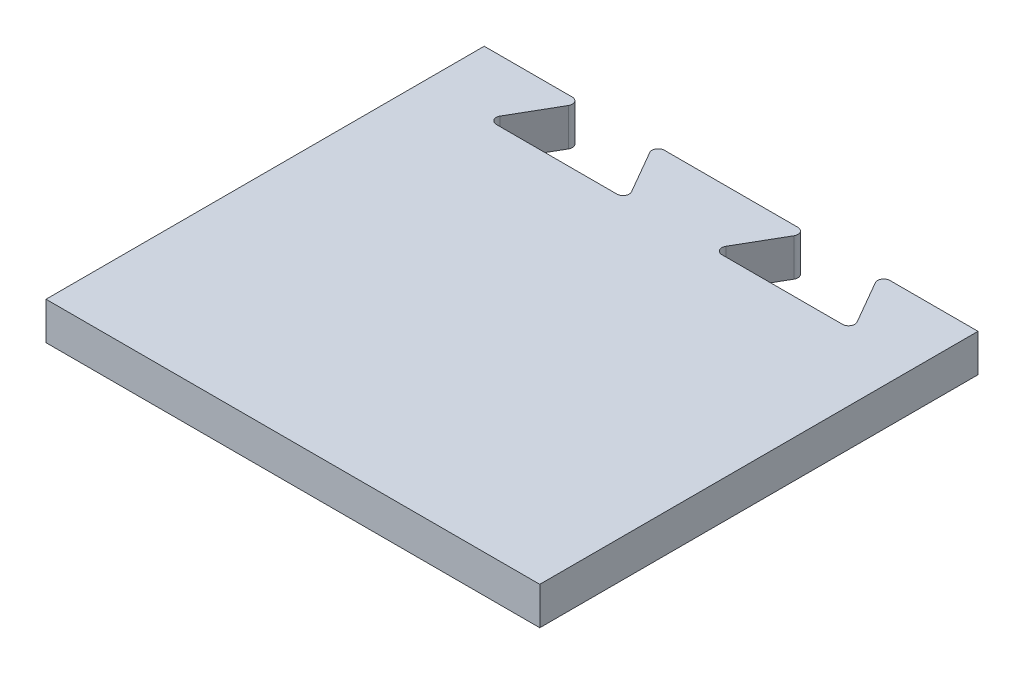
ISO-10303-21;
HEADER;
FILE_DESCRIPTION(('STEP AP214'),'2;1');
FILE_NAME('part.step','',(''),(''),'','','');
FILE_SCHEMA(('AUTOMOTIVE_DESIGN { 1 0 10303 214 1 1 1 1 }'));
ENDSEC;
DATA;
#1=APPLICATION_CONTEXT('core data for automotive mechanical design processes');
#2=APPLICATION_PROTOCOL_DEFINITION('international standard','automotive_design',2000,#1);
#3=PRODUCT_CONTEXT('',#1,'mechanical');
#4=PRODUCT('Part','Part','',(#3));
#5=PRODUCT_RELATED_PRODUCT_CATEGORY('part','',(#4));
#6=PRODUCT_DEFINITION_FORMATION('','',#4);
#7=PRODUCT_DEFINITION_CONTEXT('part definition',#1,'design');
#8=PRODUCT_DEFINITION('design','',#6,#7);
#9=PRODUCT_DEFINITION_SHAPE('','',#8);
#10=(LENGTH_UNIT() NAMED_UNIT(*) SI_UNIT(.MILLI.,.METRE.));
#11=(NAMED_UNIT(*) PLANE_ANGLE_UNIT() SI_UNIT($,.RADIAN.));
#12=(NAMED_UNIT(*) SI_UNIT($,.STERADIAN.) SOLID_ANGLE_UNIT());
#13=UNCERTAINTY_MEASURE_WITH_UNIT(LENGTH_MEASURE(1.E-05),#10,'distance_accuracy_value','');
#14=(GEOMETRIC_REPRESENTATION_CONTEXT(3) GLOBAL_UNCERTAINTY_ASSIGNED_CONTEXT((#13)) GLOBAL_UNIT_ASSIGNED_CONTEXT((#10,
#11,#12)) REPRESENTATION_CONTEXT('',''));
#15=CARTESIAN_POINT('',(0.,0.,0.));
#16=DIRECTION('',(0.,0.,1.));
#17=DIRECTION('',(1.,0.,0.));
#18=AXIS2_PLACEMENT_3D('',#15,#16,#17);
#19=CARTESIAN_POINT('',(40.,3.05,0.));
#20=DIRECTION('',(0.,0.,-1.));
#21=DIRECTION('',(-1.,0.,0.));
#22=AXIS2_PLACEMENT_3D('',#19,#20,#21);
#23=PLANE('',#22);
#24=DIRECTION('',(1.,0.,0.));
#25=VECTOR('',#24,1.);
#26=CARTESIAN_POINT('',(40.,0.,0.));
#27=LINE('',#26,#25);
#28=CARTESIAN_POINT('',(0.,0.,0.));
#29=VERTEX_POINT('',#28);
#30=CARTESIAN_POINT('',(40.,0.,0.));
#31=VERTEX_POINT('',#30);
#32=EDGE_CURVE('E206',#29,#31,#27,.T.);
#33=ORIENTED_EDGE('',*,*,#32,.T.);
#34=DIRECTION('',(0.,-1.,0.));
#35=VECTOR('',#34,1.);
#36=CARTESIAN_POINT('',(40.,3.05,0.));
#37=LINE('',#36,#35);
#38=CARTESIAN_POINT('',(40.,3.05,0.));
#39=VERTEX_POINT('',#38);
#40=EDGE_CURVE('E185',#39,#31,#37,.T.);
#41=ORIENTED_EDGE('',*,*,#40,.F.);
#42=DIRECTION('',(1.,0.,0.));
#43=VECTOR('',#42,1.);
#44=CARTESIAN_POINT('',(40.,3.05,0.));
#45=LINE('',#44,#43);
#46=CARTESIAN_POINT('',(0.,3.05,0.));
#47=VERTEX_POINT('',#46);
#48=EDGE_CURVE('E193',#47,#39,#45,.T.);
#49=ORIENTED_EDGE('',*,*,#48,.F.);
#50=DIRECTION('',(0.,-1.,0.));
#51=VECTOR('',#50,1.);
#52=CARTESIAN_POINT('',(0.,3.05,0.));
#53=LINE('',#52,#51);
#54=EDGE_CURVE('E346',#47,#29,#53,.T.);
#55=ORIENTED_EDGE('',*,*,#54,.T.);
#56=EDGE_LOOP('',(#33,#41,#49,#55));
#57=FACE_BOUND('',#56,.T.);
#58=ADVANCED_FACE('F42',(#57),#23,.F.);
#59=CARTESIAN_POINT('',(40.,3.05,-35.5));
#60=DIRECTION('',(-1.,0.,0.));
#61=DIRECTION('',(0.,0.,1.));
#62=AXIS2_PLACEMENT_3D('',#59,#60,#61);
#63=PLANE('',#62);
#64=DIRECTION('',(0.,0.,-1.));
#65=VECTOR('',#64,1.);
#66=CARTESIAN_POINT('',(40.,0.,-35.5));
#67=LINE('',#66,#65);
#68=CARTESIAN_POINT('',(40.,0.,-35.5));
#69=VERTEX_POINT('',#68);
#70=EDGE_CURVE('E349',#31,#69,#67,.T.);
#71=ORIENTED_EDGE('',*,*,#70,.T.);
#72=DIRECTION('',(0.,-1.,0.));
#73=VECTOR('',#72,1.);
#74=CARTESIAN_POINT('',(40.,3.05,-35.5));
#75=LINE('',#74,#73);
#76=CARTESIAN_POINT('',(40.,3.05,-35.5));
#77=VERTEX_POINT('',#76);
#78=EDGE_CURVE('E188',#77,#69,#75,.T.);
#79=ORIENTED_EDGE('',*,*,#78,.F.);
#80=DIRECTION('',(0.,0.,-1.));
#81=VECTOR('',#80,1.);
#82=CARTESIAN_POINT('',(40.,3.05,-35.5));
#83=LINE('',#82,#81);
#84=EDGE_CURVE('E181',#39,#77,#83,.T.);
#85=ORIENTED_EDGE('',*,*,#84,.F.);
#86=ORIENTED_EDGE('',*,*,#40,.T.);
#87=EDGE_LOOP('',(#71,#79,#85,#86));
#88=FACE_BOUND('',#87,.T.);
#89=ADVANCED_FACE('F183',(#88),#63,.F.);
#90=CARTESIAN_POINT('',(32.,3.05,-35.5));
#91=DIRECTION('',(0.,0.,1.));
#92=DIRECTION('',(1.,0.,0.));
#93=AXIS2_PLACEMENT_3D('',#90,#91,#92);
#94=PLANE('',#93);
#95=DIRECTION('',(-1.,0.,0.));
#96=VECTOR('',#95,1.);
#97=CARTESIAN_POINT('',(32.,0.,-35.5));
#98=LINE('',#97,#96);
#99=CARTESIAN_POINT('',(32.8660254037844,0.,-35.5));
#100=VERTEX_POINT('',#99);
#101=EDGE_CURVE('E352',#69,#100,#98,.T.);
#102=ORIENTED_EDGE('',*,*,#101,.T.);
#103=DIRECTION('',(0.,-1.,0.));
#104=VECTOR('',#103,1.);
#105=CARTESIAN_POINT('',(32.8660254037844,3.05,-35.5));
#106=LINE('',#105,#104);
#107=CARTESIAN_POINT('',(32.8660254037844,3.05,-35.5));
#108=VERTEX_POINT('',#107);
#109=EDGE_CURVE('E240',#100,#108,#106,.F.);
#110=ORIENTED_EDGE('',*,*,#109,.T.);
#111=DIRECTION('',(-1.,0.,0.));
#112=VECTOR('',#111,1.);
#113=CARTESIAN_POINT('',(32.,3.05,-35.5));
#114=LINE('',#113,#112);
#115=EDGE_CURVE('E192',#77,#108,#114,.T.);
#116=ORIENTED_EDGE('',*,*,#115,.F.);
#117=ORIENTED_EDGE('',*,*,#78,.T.);
#118=EDGE_LOOP('',(#102,#110,#116,#117));
#119=FACE_BOUND('',#118,.T.);
#120=ADVANCED_FACE('F393',(#119),#94,.F.);
#121=CARTESIAN_POINT('',(34.8867513459482,3.05,-30.5));
#122=DIRECTION('',(0.866025403784436,0.,-0.500000000000005));
#123=DIRECTION('',(-0.500000000000005,0.,-0.866025403784436));
#124=AXIS2_PLACEMENT_3D('',#121,#122,#123);
#125=PLANE('',#124);
#126=DIRECTION('',(0.500000000000005,0.,0.866025403784436));
#127=VECTOR('',#126,1.);
#128=CARTESIAN_POINT('',(34.8867513459482,0.,-30.5));
#129=LINE('',#128,#127);
#130=CARTESIAN_POINT('',(32.4330127018922,0.,-34.75));
#131=VERTEX_POINT('',#130);
#132=CARTESIAN_POINT('',(34.4537386440559,0.,-31.25));
#133=VERTEX_POINT('',#132);
#134=EDGE_CURVE('E356',#131,#133,#129,.T.);
#135=ORIENTED_EDGE('',*,*,#134,.T.);
#136=DIRECTION('',(0.,-1.,0.));
#137=VECTOR('',#136,1.);
#138=CARTESIAN_POINT('',(34.4537386440559,3.05,-31.25));
#139=LINE('',#138,#137);
#140=CARTESIAN_POINT('',(34.4537386440559,3.05,-31.25));
#141=VERTEX_POINT('',#140);
#142=EDGE_CURVE('E225',#133,#141,#139,.F.);
#143=ORIENTED_EDGE('',*,*,#142,.T.);
#144=DIRECTION('',(0.500000000000005,0.,0.866025403784436));
#145=VECTOR('',#144,1.);
#146=CARTESIAN_POINT('',(34.8867513459482,3.05,-30.5));
#147=LINE('',#146,#145);
#148=CARTESIAN_POINT('',(32.4330127018922,3.05,-34.75));
#149=VERTEX_POINT('',#148);
#150=EDGE_CURVE('E397',#149,#141,#147,.T.);
#151=ORIENTED_EDGE('',*,*,#150,.F.);
#152=DIRECTION('',(0.,-1.,0.));
#153=VECTOR('',#152,1.);
#154=CARTESIAN_POINT('',(32.4330127018922,3.05,-34.75));
#155=LINE('',#154,#153);
#156=EDGE_CURVE('E221',#149,#131,#155,.T.);
#157=ORIENTED_EDGE('',*,*,#156,.T.);
#158=EDGE_LOOP('',(#135,#143,#151,#157));
#159=FACE_BOUND('',#158,.T.);
#160=ADVANCED_FACE('F457',(#159),#125,.F.);
#161=CARTESIAN_POINT('',(23.3867513459482,3.05,-30.5));
#162=DIRECTION('',(0.,0.,1.));
#163=DIRECTION('',(1.,0.,0.));
#164=AXIS2_PLACEMENT_3D('',#161,#162,#163);
#165=PLANE('',#164);
#166=DIRECTION('',(-1.,0.,0.));
#167=VECTOR('',#166,1.);
#168=CARTESIAN_POINT('',(23.3867513459482,3.05,-30.5));
#169=LINE('',#168,#167);
#170=CARTESIAN_POINT('',(34.0207259421637,3.05,-30.5));
#171=VERTEX_POINT('',#170);
#172=CARTESIAN_POINT('',(24.2527767497326,3.05,-30.5));
#173=VERTEX_POINT('',#172);
#174=EDGE_CURVE('E401',#171,#173,#169,.T.);
#175=ORIENTED_EDGE('',*,*,#174,.F.);
#176=DIRECTION('',(0.,-1.,0.));
#177=VECTOR('',#176,1.);
#178=CARTESIAN_POINT('',(34.0207259421637,0.,-30.5));
#179=LINE('',#178,#177);
#180=CARTESIAN_POINT('',(34.0207259421637,0.,-30.5));
#181=VERTEX_POINT('',#180);
#182=EDGE_CURVE('E212',#171,#181,#179,.T.);
#183=ORIENTED_EDGE('',*,*,#182,.T.);
#184=DIRECTION('',(-1.,0.,0.));
#185=VECTOR('',#184,1.);
#186=CARTESIAN_POINT('',(23.3867513459482,0.,-30.5));
#187=LINE('',#186,#185);
#188=CARTESIAN_POINT('',(24.2527767497326,0.,-30.5));
#189=VERTEX_POINT('',#188);
#190=EDGE_CURVE('E360',#181,#189,#187,.T.);
#191=ORIENTED_EDGE('',*,*,#190,.T.);
#192=DIRECTION('',(0.,-1.,0.));
#193=VECTOR('',#192,1.);
#194=CARTESIAN_POINT('',(24.2527767497326,3.05,-30.5));
#195=LINE('',#194,#193);
#196=EDGE_CURVE('E208',#189,#173,#195,.F.);
#197=ORIENTED_EDGE('',*,*,#196,.T.);
#198=EDGE_LOOP('',(#175,#183,#191,#197));
#199=FACE_BOUND('',#198,.T.);
#200=ADVANCED_FACE('F450',(#199),#165,.F.);
#201=CARTESIAN_POINT('',(26.2735026918963,3.05,-35.5));
#202=DIRECTION('',(-0.866025403784436,0.,-0.500000000000004));
#203=DIRECTION('',(-0.500000000000004,0.,0.866025403784436));
#204=AXIS2_PLACEMENT_3D('',#201,#202,#203);
#205=PLANE('',#204);
#206=DIRECTION('',(0.500000000000004,0.,-0.866025403784436));
#207=VECTOR('',#206,1.);
#208=CARTESIAN_POINT('',(26.2735026918963,3.05,-35.5));
#209=LINE('',#208,#207);
#210=CARTESIAN_POINT('',(23.8197640478404,3.05,-31.25));
#211=VERTEX_POINT('',#210);
#212=CARTESIAN_POINT('',(25.8404899900041,3.05,-34.75));
#213=VERTEX_POINT('',#212);
#214=EDGE_CURVE('E407',#211,#213,#209,.T.);
#215=ORIENTED_EDGE('',*,*,#214,.F.);
#216=DIRECTION('',(0.,-1.,0.));
#217=VECTOR('',#216,1.);
#218=CARTESIAN_POINT('',(23.8197640478404,0.,-31.25));
#219=LINE('',#218,#217);
#220=CARTESIAN_POINT('',(23.8197640478404,0.,-31.25));
#221=VERTEX_POINT('',#220);
#222=EDGE_CURVE('E257',#211,#221,#219,.T.);
#223=ORIENTED_EDGE('',*,*,#222,.T.);
#224=DIRECTION('',(0.500000000000004,0.,-0.866025403784436));
#225=VECTOR('',#224,1.);
#226=CARTESIAN_POINT('',(26.2735026918963,0.,-35.5));
#227=LINE('',#226,#225);
#228=CARTESIAN_POINT('',(25.8404899900041,0.,-34.75));
#229=VERTEX_POINT('',#228);
#230=EDGE_CURVE('E364',#221,#229,#227,.T.);
#231=ORIENTED_EDGE('',*,*,#230,.T.);
#232=DIRECTION('',(0.,-1.,0.));
#233=VECTOR('',#232,1.);
#234=CARTESIAN_POINT('',(25.8404899900041,3.05,-34.75));
#235=LINE('',#234,#233);
#236=EDGE_CURVE('E254',#229,#213,#235,.F.);
#237=ORIENTED_EDGE('',*,*,#236,.T.);
#238=EDGE_LOOP('',(#215,#223,#231,#237));
#239=FACE_BOUND('',#238,.T.);
#240=ADVANCED_FACE('F441',(#239),#205,.F.);
#241=CARTESIAN_POINT('',(13.7264973081037,3.05,-35.5));
#242=DIRECTION('',(0.,0.,1.));
#243=DIRECTION('',(1.,0.,0.));
#244=AXIS2_PLACEMENT_3D('',#241,#242,#243);
#245=PLANE('',#244);
#246=DIRECTION('',(-1.,0.,0.));
#247=VECTOR('',#246,1.);
#248=CARTESIAN_POINT('',(13.7264973081037,3.05,-35.5));
#249=LINE('',#248,#247);
#250=CARTESIAN_POINT('',(25.4074772881119,3.05,-35.5));
#251=VERTEX_POINT('',#250);
#252=CARTESIAN_POINT('',(14.5925227118881,3.05,-35.5));
#253=VERTEX_POINT('',#252);
#254=EDGE_CURVE('E411',#251,#253,#249,.T.);
#255=ORIENTED_EDGE('',*,*,#254,.F.);
#256=DIRECTION('',(0.,-1.,0.));
#257=VECTOR('',#256,1.);
#258=CARTESIAN_POINT('',(25.4074772881119,3.05,-35.5));
#259=LINE('',#258,#257);
#260=CARTESIAN_POINT('',(25.4074772881119,0.,-35.5));
#261=VERTEX_POINT('',#260);
#262=EDGE_CURVE('E264',#251,#261,#259,.T.);
#263=ORIENTED_EDGE('',*,*,#262,.T.);
#264=DIRECTION('',(-1.,0.,0.));
#265=VECTOR('',#264,1.);
#266=CARTESIAN_POINT('',(13.7264973081037,0.,-35.5));
#267=LINE('',#266,#265);
#268=CARTESIAN_POINT('',(14.5925227118881,0.,-35.5));
#269=VERTEX_POINT('',#268);
#270=EDGE_CURVE('E368',#261,#269,#267,.T.);
#271=ORIENTED_EDGE('',*,*,#270,.T.);
#272=DIRECTION('',(0.,-1.,0.));
#273=VECTOR('',#272,1.);
#274=CARTESIAN_POINT('',(14.5925227118881,3.05,-35.5));
#275=LINE('',#274,#273);
#276=EDGE_CURVE('E261',#269,#253,#275,.F.);
#277=ORIENTED_EDGE('',*,*,#276,.T.);
#278=EDGE_LOOP('',(#255,#263,#271,#277));
#279=FACE_BOUND('',#278,.T.);
#280=ADVANCED_FACE('F432',(#279),#245,.F.);
#281=CARTESIAN_POINT('',(16.6132486540518,3.05,-30.5));
#282=DIRECTION('',(0.866025403784436,0.,-0.500000000000005));
#283=DIRECTION('',(-0.500000000000005,0.,-0.866025403784436));
#284=AXIS2_PLACEMENT_3D('',#281,#282,#283);
#285=PLANE('',#284);
#286=DIRECTION('',(0.500000000000005,0.,0.866025403784436));
#287=VECTOR('',#286,1.);
#288=CARTESIAN_POINT('',(16.6132486540518,3.05,-30.5));
#289=LINE('',#288,#287);
#290=CARTESIAN_POINT('',(14.1595100099959,3.05,-34.75));
#291=VERTEX_POINT('',#290);
#292=CARTESIAN_POINT('',(16.1802359521596,3.05,-31.25));
#293=VERTEX_POINT('',#292);
#294=EDGE_CURVE('E340',#291,#293,#289,.T.);
#295=ORIENTED_EDGE('',*,*,#294,.F.);
#296=DIRECTION('',(0.,-1.,0.));
#297=VECTOR('',#296,1.);
#298=CARTESIAN_POINT('',(14.1595100099959,3.05,-34.75));
#299=LINE('',#298,#297);
#300=CARTESIAN_POINT('',(14.1595100099959,0.,-34.75));
#301=VERTEX_POINT('',#300);
#302=EDGE_CURVE('E271',#291,#301,#299,.T.);
#303=ORIENTED_EDGE('',*,*,#302,.T.);
#304=DIRECTION('',(0.500000000000005,0.,0.866025403784436));
#305=VECTOR('',#304,1.);
#306=CARTESIAN_POINT('',(16.6132486540518,0.,-30.5));
#307=LINE('',#306,#305);
#308=CARTESIAN_POINT('',(16.1802359521596,0.,-31.25));
#309=VERTEX_POINT('',#308);
#310=EDGE_CURVE('E327',#301,#309,#307,.T.);
#311=ORIENTED_EDGE('',*,*,#310,.T.);
#312=DIRECTION('',(0.,-1.,0.));
#313=VECTOR('',#312,1.);
#314=CARTESIAN_POINT('',(16.1802359521596,3.05,-31.25));
#315=LINE('',#314,#313);
#316=EDGE_CURVE('E268',#309,#293,#315,.F.);
#317=ORIENTED_EDGE('',*,*,#316,.T.);
#318=EDGE_LOOP('',(#295,#303,#311,#317));
#319=FACE_BOUND('',#318,.T.);
#320=ADVANCED_FACE('F425',(#319),#285,.F.);
#321=CARTESIAN_POINT('',(5.11324865405184,3.05,-30.5));
#322=DIRECTION('',(0.,0.,1.));
#323=DIRECTION('',(1.,0.,0.));
#324=AXIS2_PLACEMENT_3D('',#321,#322,#323);
#325=PLANE('',#324);
#326=DIRECTION('',(-1.,0.,0.));
#327=VECTOR('',#326,1.);
#328=CARTESIAN_POINT('',(5.11324865405184,3.05,-30.5));
#329=LINE('',#328,#327);
#330=CARTESIAN_POINT('',(15.7472232502674,3.05,-30.5));
#331=VERTEX_POINT('',#330);
#332=CARTESIAN_POINT('',(5.97927405783628,3.05,-30.5));
#333=VERTEX_POINT('',#332);
#334=EDGE_CURVE('E332',#331,#333,#329,.T.);
#335=ORIENTED_EDGE('',*,*,#334,.F.);
#336=DIRECTION('',(0.,-1.,0.));
#337=VECTOR('',#336,1.);
#338=CARTESIAN_POINT('',(15.7472232502674,0.,-30.5));
#339=LINE('',#338,#337);
#340=CARTESIAN_POINT('',(15.7472232502674,0.,-30.5));
#341=VERTEX_POINT('',#340);
#342=EDGE_CURVE('E278',#331,#341,#339,.T.);
#343=ORIENTED_EDGE('',*,*,#342,.T.);
#344=DIRECTION('',(-1.,0.,0.));
#345=VECTOR('',#344,1.);
#346=CARTESIAN_POINT('',(5.11324865405184,0.,-30.5));
#347=LINE('',#346,#345);
#348=CARTESIAN_POINT('',(5.97927405783628,0.,-30.5));
#349=VERTEX_POINT('',#348);
#350=EDGE_CURVE('E316',#341,#349,#347,.T.);
#351=ORIENTED_EDGE('',*,*,#350,.T.);
#352=DIRECTION('',(0.,-1.,0.));
#353=VECTOR('',#352,1.);
#354=CARTESIAN_POINT('',(5.97927405783628,3.05,-30.5));
#355=LINE('',#354,#353);
#356=EDGE_CURVE('E275',#349,#333,#355,.F.);
#357=ORIENTED_EDGE('',*,*,#356,.T.);
#358=EDGE_LOOP('',(#335,#343,#351,#357));
#359=FACE_BOUND('',#358,.T.);
#360=ADVANCED_FACE('F323',(#359),#325,.F.);
#361=CARTESIAN_POINT('',(8.,3.05,-35.5));
#362=DIRECTION('',(-0.866025403784436,0.,-0.500000000000004));
#363=DIRECTION('',(-0.500000000000004,0.,0.866025403784436));
#364=AXIS2_PLACEMENT_3D('',#361,#362,#363);
#365=PLANE('',#364);
#366=DIRECTION('',(0.500000000000004,0.,-0.866025403784436));
#367=VECTOR('',#366,1.);
#368=CARTESIAN_POINT('',(8.,3.05,-35.5));
#369=LINE('',#368,#367);
#370=CARTESIAN_POINT('',(5.54626135594406,3.05,-31.25));
#371=VERTEX_POINT('',#370);
#372=CARTESIAN_POINT('',(7.56698729810778,3.05,-34.75));
#373=VERTEX_POINT('',#372);
#374=EDGE_CURVE('E331',#371,#373,#369,.T.);
#375=ORIENTED_EDGE('',*,*,#374,.F.);
#376=DIRECTION('',(0.,-1.,0.));
#377=VECTOR('',#376,1.);
#378=CARTESIAN_POINT('',(5.54626135594406,0.,-31.25));
#379=LINE('',#378,#377);
#380=CARTESIAN_POINT('',(5.54626135594406,0.,-31.25));
#381=VERTEX_POINT('',#380);
#382=EDGE_CURVE('E284',#371,#381,#379,.T.);
#383=ORIENTED_EDGE('',*,*,#382,.T.);
#384=DIRECTION('',(0.500000000000004,0.,-0.866025403784436));
#385=VECTOR('',#384,1.);
#386=CARTESIAN_POINT('',(8.,0.,-35.5));
#387=LINE('',#386,#385);
#388=CARTESIAN_POINT('',(7.56698729810778,0.,-34.75));
#389=VERTEX_POINT('',#388);
#390=EDGE_CURVE('E317',#381,#389,#387,.T.);
#391=ORIENTED_EDGE('',*,*,#390,.T.);
#392=DIRECTION('',(0.,-1.,0.));
#393=VECTOR('',#392,1.);
#394=CARTESIAN_POINT('',(7.56698729810778,3.05,-34.75));
#395=LINE('',#394,#393);
#396=EDGE_CURVE('E66',#389,#373,#395,.F.);
#397=ORIENTED_EDGE('',*,*,#396,.T.);
#398=EDGE_LOOP('',(#375,#383,#391,#397));
#399=FACE_BOUND('',#398,.T.);
#400=ADVANCED_FACE('F333',(#399),#365,.F.);
#401=CARTESIAN_POINT('',(0.,3.05,-35.5));
#402=DIRECTION('',(0.,0.,1.));
#403=DIRECTION('',(1.,0.,0.));
#404=AXIS2_PLACEMENT_3D('',#401,#402,#403);
#405=PLANE('',#404);
#406=DIRECTION('',(-1.,0.,0.));
#407=VECTOR('',#406,1.);
#408=CARTESIAN_POINT('',(0.,3.05,-35.5));
#409=LINE('',#408,#407);
#410=CARTESIAN_POINT('',(7.13397459621556,3.05,-35.5));
#411=VERTEX_POINT('',#410);
#412=CARTESIAN_POINT('',(0.,3.05,-35.5));
#413=VERTEX_POINT('',#412);
#414=EDGE_CURVE('E335',#411,#413,#409,.T.);
#415=ORIENTED_EDGE('',*,*,#414,.F.);
#416=DIRECTION('',(0.,-1.,0.));
#417=VECTOR('',#416,1.);
#418=CARTESIAN_POINT('',(7.13397459621556,3.05,-35.5));
#419=LINE('',#418,#417);
#420=CARTESIAN_POINT('',(7.13397459621556,0.,-35.5));
#421=VERTEX_POINT('',#420);
#422=EDGE_CURVE('E288',#411,#421,#419,.T.);
#423=ORIENTED_EDGE('',*,*,#422,.T.);
#424=DIRECTION('',(-1.,0.,0.));
#425=VECTOR('',#424,1.);
#426=CARTESIAN_POINT('',(0.,0.,-35.5));
#427=LINE('',#426,#425);
#428=CARTESIAN_POINT('',(0.,0.,-35.5));
#429=VERTEX_POINT('',#428);
#430=EDGE_CURVE('E377',#421,#429,#427,.T.);
#431=ORIENTED_EDGE('',*,*,#430,.T.);
#432=DIRECTION('',(0.,-1.,0.));
#433=VECTOR('',#432,1.);
#434=CARTESIAN_POINT('',(0.,3.05,-35.5));
#435=LINE('',#434,#433);
#436=EDGE_CURVE('E214',#413,#429,#435,.T.);
#437=ORIENTED_EDGE('',*,*,#436,.F.);
#438=EDGE_LOOP('',(#415,#423,#431,#437));
#439=FACE_BOUND('',#438,.T.);
#440=ADVANCED_FACE('F493',(#439),#405,.F.);
#441=CARTESIAN_POINT('',(0.,3.05,0.));
#442=DIRECTION('',(1.,0.,0.));
#443=DIRECTION('',(0.,0.,-1.));
#444=AXIS2_PLACEMENT_3D('',#441,#442,#443);
#445=PLANE('',#444);
#446=DIRECTION('',(0.,0.,1.));
#447=VECTOR('',#446,1.);
#448=CARTESIAN_POINT('',(0.,0.,0.));
#449=LINE('',#448,#447);
#450=EDGE_CURVE('E203',#429,#29,#449,.T.);
#451=ORIENTED_EDGE('',*,*,#450,.T.);
#452=ORIENTED_EDGE('',*,*,#54,.F.);
#453=DIRECTION('',(0.,0.,1.));
#454=VECTOR('',#453,1.);
#455=CARTESIAN_POINT('',(0.,3.05,0.));
#456=LINE('',#455,#454);
#457=EDGE_CURVE('E198',#413,#47,#456,.T.);
#458=ORIENTED_EDGE('',*,*,#457,.F.);
#459=ORIENTED_EDGE('',*,*,#436,.T.);
#460=EDGE_LOOP('',(#451,#452,#458,#459));
#461=FACE_BOUND('',#460,.T.);
#462=ADVANCED_FACE('F388',(#461),#445,.F.);
#463=CARTESIAN_POINT('',(0.,3.05,0.));
#464=DIRECTION('',(0.,-1.,0.));
#465=DIRECTION('',(0.,0.,-1.));
#466=AXIS2_PLACEMENT_3D('',#463,#464,#465);
#467=PLANE('',#466);
#468=ORIENTED_EDGE('',*,*,#115,.T.);
#469=CARTESIAN_POINT('',(32.8660254037844,3.05,-35.));
#470=DIRECTION('',(0.,-1.,0.));
#471=DIRECTION('',(0.,0.,-1.));
#472=AXIS2_PLACEMENT_3D('',#469,#470,#471);
#473=CIRCLE('',#472,0.5);
#474=EDGE_CURVE('E251',#108,#149,#473,.F.);
#475=ORIENTED_EDGE('',*,*,#474,.T.);
#476=ORIENTED_EDGE('',*,*,#150,.T.);
#477=CARTESIAN_POINT('',(34.0207259421637,3.05,-31.));
#478=DIRECTION('',(0.,-1.,0.));
#479=DIRECTION('',(0.,0.,-1.));
#480=AXIS2_PLACEMENT_3D('',#477,#478,#479);
#481=CIRCLE('',#480,0.5);
#482=EDGE_CURVE('E295',#141,#171,#481,.T.);
#483=ORIENTED_EDGE('',*,*,#482,.T.);
#484=ORIENTED_EDGE('',*,*,#174,.T.);
#485=CARTESIAN_POINT('',(24.2527767497326,3.05,-31.));
#486=DIRECTION('',(0.,-1.,0.));
#487=DIRECTION('',(0.,0.,-1.));
#488=AXIS2_PLACEMENT_3D('',#485,#486,#487);
#489=CIRCLE('',#488,0.5);
#490=EDGE_CURVE('E301',#173,#211,#489,.T.);
#491=ORIENTED_EDGE('',*,*,#490,.T.);
#492=ORIENTED_EDGE('',*,*,#214,.T.);
#493=CARTESIAN_POINT('',(25.4074772881119,3.05,-35.));
#494=DIRECTION('',(0.,-1.,0.));
#495=DIRECTION('',(0.,0.,-1.));
#496=AXIS2_PLACEMENT_3D('',#493,#494,#495);
#497=CIRCLE('',#496,0.5);
#498=EDGE_CURVE('E248',#213,#251,#497,.F.);
#499=ORIENTED_EDGE('',*,*,#498,.T.);
#500=ORIENTED_EDGE('',*,*,#254,.T.);
#501=CARTESIAN_POINT('',(14.5925227118881,3.05,-35.));
#502=DIRECTION('',(0.,-1.,0.));
#503=DIRECTION('',(0.,0.,-1.));
#504=AXIS2_PLACEMENT_3D('',#501,#502,#503);
#505=CIRCLE('',#504,0.5);
#506=EDGE_CURVE('E245',#253,#291,#505,.F.);
#507=ORIENTED_EDGE('',*,*,#506,.T.);
#508=ORIENTED_EDGE('',*,*,#294,.T.);
#509=CARTESIAN_POINT('',(15.7472232502674,3.05,-31.));
#510=DIRECTION('',(0.,-1.,0.));
#511=DIRECTION('',(0.,0.,-1.));
#512=AXIS2_PLACEMENT_3D('',#509,#510,#511);
#513=CIRCLE('',#512,0.5);
#514=EDGE_CURVE('E307',#293,#331,#513,.T.);
#515=ORIENTED_EDGE('',*,*,#514,.T.);
#516=ORIENTED_EDGE('',*,*,#334,.T.);
#517=CARTESIAN_POINT('',(5.97927405783628,3.05,-31.));
#518=DIRECTION('',(0.,-1.,0.));
#519=DIRECTION('',(0.,0.,-1.));
#520=AXIS2_PLACEMENT_3D('',#517,#518,#519);
#521=CIRCLE('',#520,0.5);
#522=EDGE_CURVE('E11',#333,#371,#521,.T.);
#523=ORIENTED_EDGE('',*,*,#522,.T.);
#524=ORIENTED_EDGE('',*,*,#374,.T.);
#525=CARTESIAN_POINT('',(7.13397459621556,3.05,-35.));
#526=DIRECTION('',(0.,-1.,0.));
#527=DIRECTION('',(0.,0.,-1.));
#528=AXIS2_PLACEMENT_3D('',#525,#526,#527);
#529=CIRCLE('',#528,0.5);
#530=EDGE_CURVE('E58',#373,#411,#529,.F.);
#531=ORIENTED_EDGE('',*,*,#530,.T.);
#532=ORIENTED_EDGE('',*,*,#414,.T.);
#533=ORIENTED_EDGE('',*,*,#457,.T.);
#534=ORIENTED_EDGE('',*,*,#48,.T.);
#535=ORIENTED_EDGE('',*,*,#84,.T.);
#536=EDGE_LOOP('',(#468,#475,#476,#483,#484,#491,#492,#499,#500,#507,#508,#515,#516,#523,#524,
#531,#532,#533,#534,#535));
#537=FACE_BOUND('',#536,.T.);
#538=ADVANCED_FACE('F196',(#537),#467,.F.);
#539=CARTESIAN_POINT('',(0.,0.,0.));
#540=DIRECTION('',(0.,-1.,0.));
#541=DIRECTION('',(0.,0.,-1.));
#542=AXIS2_PLACEMENT_3D('',#539,#540,#541);
#543=PLANE('',#542);
#544=ORIENTED_EDGE('',*,*,#134,.F.);
#545=CARTESIAN_POINT('',(32.8660254037844,0.,-35.));
#546=DIRECTION('',(0.,-1.,0.));
#547=DIRECTION('',(0.,0.,-1.));
#548=AXIS2_PLACEMENT_3D('',#545,#546,#547);
#549=CIRCLE('',#548,0.5);
#550=EDGE_CURVE('E237',#131,#100,#549,.T.);
#551=ORIENTED_EDGE('',*,*,#550,.T.);
#552=ORIENTED_EDGE('',*,*,#101,.F.);
#553=ORIENTED_EDGE('',*,*,#70,.F.);
#554=ORIENTED_EDGE('',*,*,#32,.F.);
#555=ORIENTED_EDGE('',*,*,#450,.F.);
#556=ORIENTED_EDGE('',*,*,#430,.F.);
#557=CARTESIAN_POINT('',(7.13397459621556,0.,-35.));
#558=DIRECTION('',(0.,-1.,0.));
#559=DIRECTION('',(0.,0.,-1.));
#560=AXIS2_PLACEMENT_3D('',#557,#558,#559);
#561=CIRCLE('',#560,0.5);
#562=EDGE_CURVE('E228',#421,#389,#561,.T.);
#563=ORIENTED_EDGE('',*,*,#562,.T.);
#564=ORIENTED_EDGE('',*,*,#390,.F.);
#565=CARTESIAN_POINT('',(5.97927405783628,0.,-31.));
#566=DIRECTION('',(0.,-1.,0.));
#567=DIRECTION('',(0.,0.,-1.));
#568=AXIS2_PLACEMENT_3D('',#565,#566,#567);
#569=CIRCLE('',#568,0.5);
#570=EDGE_CURVE('E51',#381,#349,#569,.F.);
#571=ORIENTED_EDGE('',*,*,#570,.T.);
#572=ORIENTED_EDGE('',*,*,#350,.F.);
#573=CARTESIAN_POINT('',(15.7472232502674,0.,-31.));
#574=DIRECTION('',(0.,-1.,0.));
#575=DIRECTION('',(0.,0.,-1.));
#576=AXIS2_PLACEMENT_3D('',#573,#574,#575);
#577=CIRCLE('',#576,0.5);
#578=EDGE_CURVE('E304',#341,#309,#577,.F.);
#579=ORIENTED_EDGE('',*,*,#578,.T.);
#580=ORIENTED_EDGE('',*,*,#310,.F.);
#581=CARTESIAN_POINT('',(14.5925227118881,0.,-35.));
#582=DIRECTION('',(0.,-1.,0.));
#583=DIRECTION('',(0.,0.,-1.));
#584=AXIS2_PLACEMENT_3D('',#581,#582,#583);
#585=CIRCLE('',#584,0.5);
#586=EDGE_CURVE('E231',#301,#269,#585,.T.);
#587=ORIENTED_EDGE('',*,*,#586,.T.);
#588=ORIENTED_EDGE('',*,*,#270,.F.);
#589=CARTESIAN_POINT('',(25.4074772881119,0.,-35.));
#590=DIRECTION('',(0.,-1.,0.));
#591=DIRECTION('',(0.,0.,-1.));
#592=AXIS2_PLACEMENT_3D('',#589,#590,#591);
#593=CIRCLE('',#592,0.5);
#594=EDGE_CURVE('E234',#261,#229,#593,.T.);
#595=ORIENTED_EDGE('',*,*,#594,.T.);
#596=ORIENTED_EDGE('',*,*,#230,.F.);
#597=CARTESIAN_POINT('',(24.2527767497326,0.,-31.));
#598=DIRECTION('',(0.,-1.,0.));
#599=DIRECTION('',(0.,0.,-1.));
#600=AXIS2_PLACEMENT_3D('',#597,#598,#599);
#601=CIRCLE('',#600,0.5);
#602=EDGE_CURVE('E298',#221,#189,#601,.F.);
#603=ORIENTED_EDGE('',*,*,#602,.T.);
#604=ORIENTED_EDGE('',*,*,#190,.F.);
#605=CARTESIAN_POINT('',(34.0207259421637,0.,-31.));
#606=DIRECTION('',(0.,-1.,0.));
#607=DIRECTION('',(0.,0.,-1.));
#608=AXIS2_PLACEMENT_3D('',#605,#606,#607);
#609=CIRCLE('',#608,0.5);
#610=EDGE_CURVE('E292',#181,#133,#609,.F.);
#611=ORIENTED_EDGE('',*,*,#610,.T.);
#612=EDGE_LOOP('',(#544,#551,#552,#553,#554,#555,#556,#563,#564,#571,#572,#579,#580,#587,#588,
#595,#596,#603,#604,#611));
#613=FACE_BOUND('',#612,.T.);
#614=ADVANCED_FACE('F315',(#613),#543,.T.);
#615=CARTESIAN_POINT('',(34.0207259421637,3.05,-31.));
#616=DIRECTION('',(0.,1.,0.));
#617=DIRECTION('',(0.,0.,1.));
#618=AXIS2_PLACEMENT_3D('',#615,#616,#617);
#619=CYLINDRICAL_SURFACE('',#618,0.5);
#620=ORIENTED_EDGE('',*,*,#482,.F.);
#621=ORIENTED_EDGE('',*,*,#142,.F.);
#622=ORIENTED_EDGE('',*,*,#610,.F.);
#623=ORIENTED_EDGE('',*,*,#182,.F.);
#624=EDGE_LOOP('',(#620,#621,#622,#623));
#625=FACE_BOUND('',#624,.T.);
#626=ADVANCED_FACE('F454',(#625),#619,.F.);
#627=CARTESIAN_POINT('',(32.8660254037844,3.05,-35.));
#628=DIRECTION('',(0.,-1.,0.));
#629=DIRECTION('',(0.,0.,-1.));
#630=AXIS2_PLACEMENT_3D('',#627,#628,#629);
#631=CYLINDRICAL_SURFACE('',#630,0.5);
#632=ORIENTED_EDGE('',*,*,#474,.F.);
#633=ORIENTED_EDGE('',*,*,#109,.F.);
#634=ORIENTED_EDGE('',*,*,#550,.F.);
#635=ORIENTED_EDGE('',*,*,#156,.F.);
#636=EDGE_LOOP('',(#632,#633,#634,#635));
#637=FACE_BOUND('',#636,.T.);
#638=ADVANCED_FACE('F461',(#637),#631,.T.);
#639=CARTESIAN_POINT('',(24.2527767497326,3.05,-31.));
#640=DIRECTION('',(0.,1.,0.));
#641=DIRECTION('',(0.,0.,1.));
#642=AXIS2_PLACEMENT_3D('',#639,#640,#641);
#643=CYLINDRICAL_SURFACE('',#642,0.5);
#644=ORIENTED_EDGE('',*,*,#490,.F.);
#645=ORIENTED_EDGE('',*,*,#196,.F.);
#646=ORIENTED_EDGE('',*,*,#602,.F.);
#647=ORIENTED_EDGE('',*,*,#222,.F.);
#648=EDGE_LOOP('',(#644,#645,#646,#647));
#649=FACE_BOUND('',#648,.T.);
#650=ADVANCED_FACE('F445',(#649),#643,.F.);
#651=CARTESIAN_POINT('',(25.4074772881119,3.05,-35.));
#652=DIRECTION('',(0.,-1.,0.));
#653=DIRECTION('',(0.,0.,-1.));
#654=AXIS2_PLACEMENT_3D('',#651,#652,#653);
#655=CYLINDRICAL_SURFACE('',#654,0.5);
#656=ORIENTED_EDGE('',*,*,#498,.F.);
#657=ORIENTED_EDGE('',*,*,#236,.F.);
#658=ORIENTED_EDGE('',*,*,#594,.F.);
#659=ORIENTED_EDGE('',*,*,#262,.F.);
#660=EDGE_LOOP('',(#656,#657,#658,#659));
#661=FACE_BOUND('',#660,.T.);
#662=ADVANCED_FACE('F436',(#661),#655,.T.);
#663=CARTESIAN_POINT('',(14.5925227118881,3.05,-35.));
#664=DIRECTION('',(0.,-1.,0.));
#665=DIRECTION('',(0.,0.,-1.));
#666=AXIS2_PLACEMENT_3D('',#663,#664,#665);
#667=CYLINDRICAL_SURFACE('',#666,0.5);
#668=ORIENTED_EDGE('',*,*,#506,.F.);
#669=ORIENTED_EDGE('',*,*,#276,.F.);
#670=ORIENTED_EDGE('',*,*,#586,.F.);
#671=ORIENTED_EDGE('',*,*,#302,.F.);
#672=EDGE_LOOP('',(#668,#669,#670,#671));
#673=FACE_BOUND('',#672,.T.);
#674=ADVANCED_FACE('F427',(#673),#667,.T.);
#675=CARTESIAN_POINT('',(15.7472232502674,3.05,-31.));
#676=DIRECTION('',(0.,1.,0.));
#677=DIRECTION('',(0.,0.,1.));
#678=AXIS2_PLACEMENT_3D('',#675,#676,#677);
#679=CYLINDRICAL_SURFACE('',#678,0.5);
#680=ORIENTED_EDGE('',*,*,#514,.F.);
#681=ORIENTED_EDGE('',*,*,#316,.F.);
#682=ORIENTED_EDGE('',*,*,#578,.F.);
#683=ORIENTED_EDGE('',*,*,#342,.F.);
#684=EDGE_LOOP('',(#680,#681,#682,#683));
#685=FACE_BOUND('',#684,.T.);
#686=ADVANCED_FACE('F423',(#685),#679,.F.);
#687=CARTESIAN_POINT('',(5.97927405783628,3.05,-31.));
#688=DIRECTION('',(0.,1.,0.));
#689=DIRECTION('',(0.,0.,1.));
#690=AXIS2_PLACEMENT_3D('',#687,#688,#689);
#691=CYLINDRICAL_SURFACE('',#690,0.5);
#692=ORIENTED_EDGE('',*,*,#522,.F.);
#693=ORIENTED_EDGE('',*,*,#356,.F.);
#694=ORIENTED_EDGE('',*,*,#570,.F.);
#695=ORIENTED_EDGE('',*,*,#382,.F.);
#696=EDGE_LOOP('',(#692,#693,#694,#695));
#697=FACE_BOUND('',#696,.T.);
#698=ADVANCED_FACE('F330',(#697),#691,.F.);
#699=CARTESIAN_POINT('',(7.13397459621556,3.05,-35.));
#700=DIRECTION('',(0.,-1.,0.));
#701=DIRECTION('',(0.,0.,-1.));
#702=AXIS2_PLACEMENT_3D('',#699,#700,#701);
#703=CYLINDRICAL_SURFACE('',#702,0.5);
#704=ORIENTED_EDGE('',*,*,#530,.F.);
#705=ORIENTED_EDGE('',*,*,#396,.F.);
#706=ORIENTED_EDGE('',*,*,#562,.F.);
#707=ORIENTED_EDGE('',*,*,#422,.F.);
#708=EDGE_LOOP('',(#704,#705,#706,#707));
#709=FACE_BOUND('',#708,.T.);
#710=ADVANCED_FACE('F44',(#709),#703,.T.);
#711=CLOSED_SHELL('',(#58,#89,#120,#160,#200,#240,#280,#320,#360,#400,#440,#462,#538,#614,#626,
#638,#650,#662,#674,#686,#698,#710));
#712=MANIFOLD_SOLID_BREP('B2',#711);
#713=ADVANCED_BREP_SHAPE_REPRESENTATION('',(#18,#712),#14);
#714=SHAPE_DEFINITION_REPRESENTATION(#9,#713);
ENDSEC;
END-ISO-10303-21;
